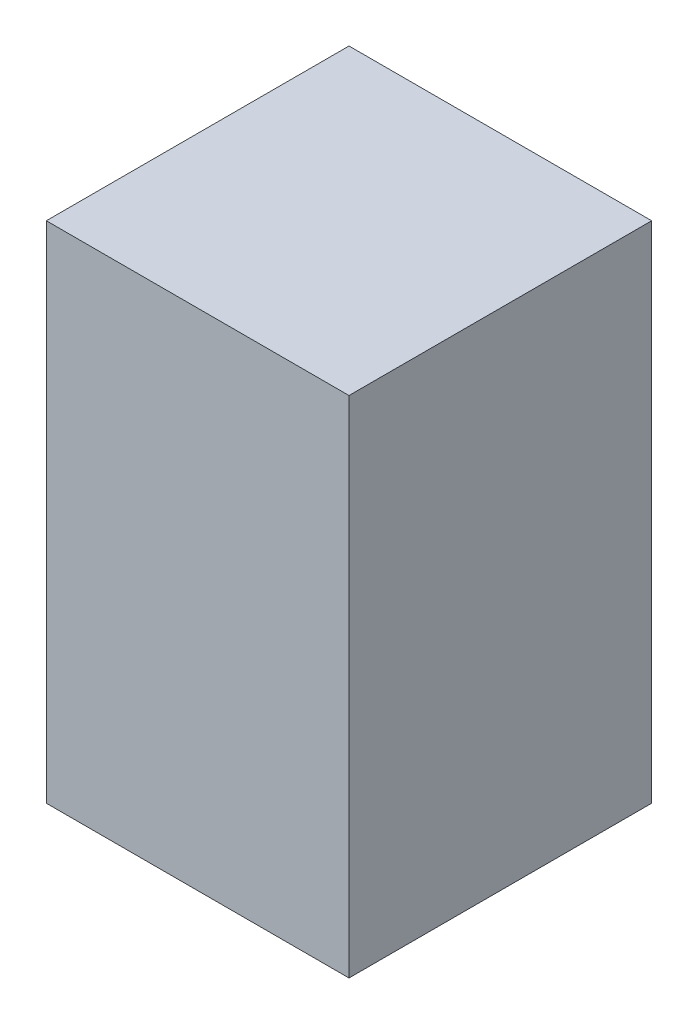
ISO-10303-21;
HEADER;
FILE_DESCRIPTION(('STEP AP214'),'2;1');
FILE_NAME('part.step','',(''),(''),'','','');
FILE_SCHEMA(('AUTOMOTIVE_DESIGN { 1 0 10303 214 1 1 1 1 }'));
ENDSEC;
DATA;
#1=APPLICATION_CONTEXT('core data for automotive mechanical design processes');
#2=APPLICATION_PROTOCOL_DEFINITION('international standard','automotive_design',2000,#1);
#3=PRODUCT_CONTEXT('',#1,'mechanical');
#4=PRODUCT('Part','Part','',(#3));
#5=PRODUCT_RELATED_PRODUCT_CATEGORY('part','',(#4));
#6=PRODUCT_DEFINITION_FORMATION('','',#4);
#7=PRODUCT_DEFINITION_CONTEXT('part definition',#1,'design');
#8=PRODUCT_DEFINITION('design','',#6,#7);
#9=PRODUCT_DEFINITION_SHAPE('','',#8);
#10=(LENGTH_UNIT() NAMED_UNIT(*) SI_UNIT(.MILLI.,.METRE.));
#11=(NAMED_UNIT(*) PLANE_ANGLE_UNIT() SI_UNIT($,.RADIAN.));
#12=(NAMED_UNIT(*) SI_UNIT($,.STERADIAN.) SOLID_ANGLE_UNIT());
#13=UNCERTAINTY_MEASURE_WITH_UNIT(LENGTH_MEASURE(1.E-05),#10,'distance_accuracy_value','');
#14=(GEOMETRIC_REPRESENTATION_CONTEXT(3) GLOBAL_UNCERTAINTY_ASSIGNED_CONTEXT((#13)) GLOBAL_UNIT_ASSIGNED_CONTEXT((#10,
#11,#12)) REPRESENTATION_CONTEXT('',''));
#15=CARTESIAN_POINT('',(0.,0.,0.));
#16=DIRECTION('',(0.,0.,1.));
#17=DIRECTION('',(1.,0.,0.));
#18=AXIS2_PLACEMENT_3D('',#15,#16,#17);
#19=CARTESIAN_POINT('',(-6.,10.,-3.66216216216216));
#20=DIRECTION('',(1.,0.,0.));
#21=DIRECTION('',(0.,0.,-1.));
#22=AXIS2_PLACEMENT_3D('',#19,#20,#21);
#23=PLANE('',#22);
#24=DIRECTION('',(0.,0.,1.));
#25=VECTOR('',#24,1.);
#26=CARTESIAN_POINT('',(-6.,0.,-3.66216216216216));
#27=LINE('',#26,#25);
#28=CARTESIAN_POINT('',(-6.,0.,-3.66216216216216));
#29=VERTEX_POINT('',#28);
#30=CARTESIAN_POINT('',(-6.,0.,2.33783783783784));
#31=VERTEX_POINT('',#30);
#32=EDGE_CURVE('E113',#29,#31,#27,.T.);
#33=ORIENTED_EDGE('',*,*,#32,.T.);
#34=DIRECTION('',(0.,-1.,0.));
#35=VECTOR('',#34,1.);
#36=CARTESIAN_POINT('',(-6.,10.,2.33783783783784));
#37=LINE('',#36,#35);
#38=CARTESIAN_POINT('',(-6.,10.,2.33783783783784));
#39=VERTEX_POINT('',#38);
#40=EDGE_CURVE('E11',#39,#31,#37,.T.);
#41=ORIENTED_EDGE('',*,*,#40,.F.);
#42=DIRECTION('',(0.,0.,1.));
#43=VECTOR('',#42,1.);
#44=CARTESIAN_POINT('',(-6.,10.,-3.66216216216216));
#45=LINE('',#44,#43);
#46=CARTESIAN_POINT('',(-6.,10.,-3.66216216216216));
#47=VERTEX_POINT('',#46);
#48=EDGE_CURVE('E97',#47,#39,#45,.T.);
#49=ORIENTED_EDGE('',*,*,#48,.F.);
#50=DIRECTION('',(0.,-1.,0.));
#51=VECTOR('',#50,1.);
#52=CARTESIAN_POINT('',(-6.,10.,-3.66216216216216));
#53=LINE('',#52,#51);
#54=EDGE_CURVE('E109',#47,#29,#53,.T.);
#55=ORIENTED_EDGE('',*,*,#54,.T.);
#56=EDGE_LOOP('',(#33,#41,#49,#55));
#57=FACE_BOUND('',#56,.T.);
#58=ADVANCED_FACE('F45',(#57),#23,.F.);
#59=CARTESIAN_POINT('',(-6.,10.,2.33783783783784));
#60=DIRECTION('',(0.,0.,-1.));
#61=DIRECTION('',(-1.,0.,0.));
#62=AXIS2_PLACEMENT_3D('',#59,#60,#61);
#63=PLANE('',#62);
#64=DIRECTION('',(1.,0.,0.));
#65=VECTOR('',#64,1.);
#66=CARTESIAN_POINT('',(-6.,0.,2.33783783783784));
#67=LINE('',#66,#65);
#68=CARTESIAN_POINT('',(0.,0.,2.33783783783784));
#69=VERTEX_POINT('',#68);
#70=EDGE_CURVE('E102',#31,#69,#67,.T.);
#71=ORIENTED_EDGE('',*,*,#70,.T.);
#72=DIRECTION('',(0.,-1.,0.));
#73=VECTOR('',#72,1.);
#74=CARTESIAN_POINT('',(0.,10.,2.33783783783784));
#75=LINE('',#74,#73);
#76=CARTESIAN_POINT('',(0.,10.,2.33783783783784));
#77=VERTEX_POINT('',#76);
#78=EDGE_CURVE('E54',#77,#69,#75,.T.);
#79=ORIENTED_EDGE('',*,*,#78,.F.);
#80=DIRECTION('',(1.,0.,0.));
#81=VECTOR('',#80,1.);
#82=CARTESIAN_POINT('',(-6.,10.,2.33783783783784));
#83=LINE('',#82,#81);
#84=EDGE_CURVE('E92',#39,#77,#83,.T.);
#85=ORIENTED_EDGE('',*,*,#84,.F.);
#86=ORIENTED_EDGE('',*,*,#40,.T.);
#87=EDGE_LOOP('',(#71,#79,#85,#86));
#88=FACE_BOUND('',#87,.T.);
#89=ADVANCED_FACE('F101',(#88),#63,.F.);
#90=CARTESIAN_POINT('',(0.,10.,-3.66216216216216));
#91=DIRECTION('',(-1.,0.,0.));
#92=DIRECTION('',(0.,0.,1.));
#93=AXIS2_PLACEMENT_3D('',#90,#91,#92);
#94=PLANE('',#93);
#95=DIRECTION('',(0.,0.,-1.));
#96=VECTOR('',#95,1.);
#97=CARTESIAN_POINT('',(0.,0.,-3.66216216216216));
#98=LINE('',#97,#96);
#99=CARTESIAN_POINT('',(0.,0.,-3.66216216216216));
#100=VERTEX_POINT('',#99);
#101=EDGE_CURVE('E79',#69,#100,#98,.T.);
#102=ORIENTED_EDGE('',*,*,#101,.T.);
#103=DIRECTION('',(0.,-1.,0.));
#104=VECTOR('',#103,1.);
#105=CARTESIAN_POINT('',(0.,10.,-3.66216216216216));
#106=LINE('',#105,#104);
#107=CARTESIAN_POINT('',(0.,10.,-3.66216216216216));
#108=VERTEX_POINT('',#107);
#109=EDGE_CURVE('E104',#108,#100,#106,.T.);
#110=ORIENTED_EDGE('',*,*,#109,.F.);
#111=DIRECTION('',(0.,0.,-1.));
#112=VECTOR('',#111,1.);
#113=CARTESIAN_POINT('',(0.,10.,-3.66216216216216));
#114=LINE('',#113,#112);
#115=EDGE_CURVE('E95',#77,#108,#114,.T.);
#116=ORIENTED_EDGE('',*,*,#115,.F.);
#117=ORIENTED_EDGE('',*,*,#78,.T.);
#118=EDGE_LOOP('',(#102,#110,#116,#117));
#119=FACE_BOUND('',#118,.T.);
#120=ADVANCED_FACE('F105',(#119),#94,.F.);
#121=CARTESIAN_POINT('',(-6.,10.,-3.66216216216216));
#122=DIRECTION('',(0.,0.,1.));
#123=DIRECTION('',(1.,0.,0.));
#124=AXIS2_PLACEMENT_3D('',#121,#122,#123);
#125=PLANE('',#124);
#126=DIRECTION('',(-1.,0.,0.));
#127=VECTOR('',#126,1.);
#128=CARTESIAN_POINT('',(-6.,0.,-3.66216216216216));
#129=LINE('',#128,#127);
#130=EDGE_CURVE('E85',#100,#29,#129,.T.);
#131=ORIENTED_EDGE('',*,*,#130,.T.);
#132=ORIENTED_EDGE('',*,*,#54,.F.);
#133=DIRECTION('',(-1.,0.,0.));
#134=VECTOR('',#133,1.);
#135=CARTESIAN_POINT('',(-6.,10.,-3.66216216216216));
#136=LINE('',#135,#134);
#137=EDGE_CURVE('E62',#108,#47,#136,.T.);
#138=ORIENTED_EDGE('',*,*,#137,.F.);
#139=ORIENTED_EDGE('',*,*,#109,.T.);
#140=EDGE_LOOP('',(#131,#132,#138,#139));
#141=FACE_BOUND('',#140,.T.);
#142=ADVANCED_FACE('F126',(#141),#125,.F.);
#143=CARTESIAN_POINT('',(0.,10.,0.));
#144=DIRECTION('',(0.,1.,0.));
#145=DIRECTION('',(0.,0.,1.));
#146=AXIS2_PLACEMENT_3D('',#143,#144,#145);
#147=PLANE('',#146);
#148=ORIENTED_EDGE('',*,*,#48,.T.);
#149=ORIENTED_EDGE('',*,*,#84,.T.);
#150=ORIENTED_EDGE('',*,*,#115,.T.);
#151=ORIENTED_EDGE('',*,*,#137,.T.);
#152=EDGE_LOOP('',(#148,#149,#150,#151));
#153=FACE_BOUND('',#152,.T.);
#154=ADVANCED_FACE('F93',(#153),#147,.T.);
#155=CARTESIAN_POINT('',(0.,0.,0.));
#156=DIRECTION('',(0.,1.,0.));
#157=DIRECTION('',(0.,0.,1.));
#158=AXIS2_PLACEMENT_3D('',#155,#156,#157);
#159=PLANE('',#158);
#160=ORIENTED_EDGE('',*,*,#32,.F.);
#161=ORIENTED_EDGE('',*,*,#130,.F.);
#162=ORIENTED_EDGE('',*,*,#101,.F.);
#163=ORIENTED_EDGE('',*,*,#70,.F.);
#164=EDGE_LOOP('',(#160,#161,#162,#163));
#165=FACE_BOUND('',#164,.T.);
#166=ADVANCED_FACE('F129',(#165),#159,.F.);
#167=CLOSED_SHELL('',(#58,#89,#120,#142,#154,#166));
#168=MANIFOLD_SOLID_BREP('B2',#167);
#169=ADVANCED_BREP_SHAPE_REPRESENTATION('',(#18,#168),#14);
#170=SHAPE_DEFINITION_REPRESENTATION(#9,#169);
ENDSEC;
END-ISO-10303-21;
